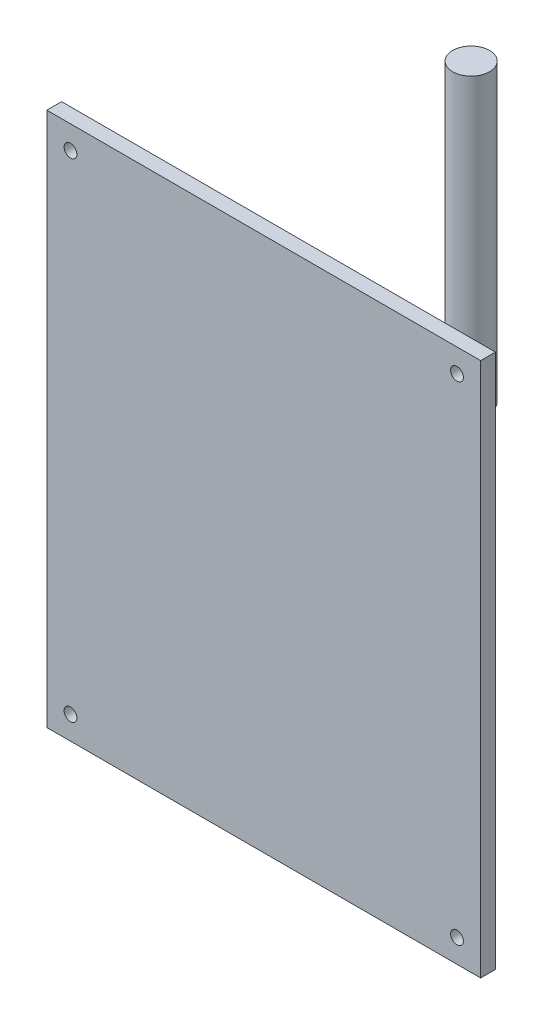
ISO-10303-21;
HEADER;
FILE_DESCRIPTION(('STEP AP214'),'2;1');
FILE_NAME('part.step','',(''),(''),'','','');
FILE_SCHEMA(('AUTOMOTIVE_DESIGN { 1 0 10303 214 1 1 1 1 }'));
ENDSEC;
DATA;
#1=APPLICATION_CONTEXT('core data for automotive mechanical design processes');
#2=APPLICATION_PROTOCOL_DEFINITION('international standard','automotive_design',2000,#1);
#3=PRODUCT_CONTEXT('',#1,'mechanical');
#4=PRODUCT('Part','Part','',(#3));
#5=PRODUCT_RELATED_PRODUCT_CATEGORY('part','',(#4));
#6=PRODUCT_DEFINITION_FORMATION('','',#4);
#7=PRODUCT_DEFINITION_CONTEXT('part definition',#1,'design');
#8=PRODUCT_DEFINITION('design','',#6,#7);
#9=PRODUCT_DEFINITION_SHAPE('','',#8);
#10=(LENGTH_UNIT() NAMED_UNIT(*) SI_UNIT(.MILLI.,.METRE.));
#11=(NAMED_UNIT(*) PLANE_ANGLE_UNIT() SI_UNIT($,.RADIAN.));
#12=(NAMED_UNIT(*) SI_UNIT($,.STERADIAN.) SOLID_ANGLE_UNIT());
#13=UNCERTAINTY_MEASURE_WITH_UNIT(LENGTH_MEASURE(1.E-05),#10,'distance_accuracy_value','');
#14=(GEOMETRIC_REPRESENTATION_CONTEXT(3) GLOBAL_UNCERTAINTY_ASSIGNED_CONTEXT((#13)) GLOBAL_UNIT_ASSIGNED_CONTEXT((#10,
#11,#12)) REPRESENTATION_CONTEXT('',''));
#15=CARTESIAN_POINT('',(0.,0.,0.));
#16=DIRECTION('',(0.,0.,1.));
#17=DIRECTION('',(1.,0.,0.));
#18=AXIS2_PLACEMENT_3D('',#15,#16,#17);
#19=CARTESIAN_POINT('',(29.9639569522915,33.3,-3.175));
#20=DIRECTION('',(0.,1.,0.));
#21=DIRECTION('',(0.,0.,1.));
#22=AXIS2_PLACEMENT_3D('',#19,#20,#21);
#23=CYLINDRICAL_SURFACE('',#22,3.175);
#24=CARTESIAN_POINT('',(29.9639569522915,33.3,-3.175));
#25=DIRECTION('',(0.,1.,0.));
#26=DIRECTION('',(0.,0.,1.));
#27=AXIS2_PLACEMENT_3D('',#24,#25,#26);
#28=CIRCLE('',#27,3.175);
#29=CARTESIAN_POINT('',(29.9639569522915,33.3,0.));
#30=VERTEX_POINT('',#29);
#31=EDGE_CURVE('E11',#30,#30,#28,.T.);
#32=ORIENTED_EDGE('',*,*,#31,.T.);
#33=EDGE_LOOP('',(#32));
#34=FACE_BOUND('',#33,.T.);
#35=CARTESIAN_POINT('',(29.9639569522915,84.1,-3.175));
#36=DIRECTION('',(0.,1.,0.));
#37=DIRECTION('',(0.,0.,1.));
#38=AXIS2_PLACEMENT_3D('',#35,#36,#37);
#39=CIRCLE('',#38,3.175);
#40=CARTESIAN_POINT('',(29.9639569522915,84.1,0.));
#41=VERTEX_POINT('',#40);
#42=EDGE_CURVE('E56',#41,#41,#39,.T.);
#43=ORIENTED_EDGE('',*,*,#42,.F.);
#44=EDGE_LOOP('',(#43));
#45=FACE_BOUND('',#44,.T.);
#46=ADVANCED_FACE('F50',(#34,#45),#23,.T.);
#47=CARTESIAN_POINT('',(29.9639569522915,33.3,-3.175));
#48=DIRECTION('',(0.,1.,0.));
#49=DIRECTION('',(0.,0.,1.));
#50=AXIS2_PLACEMENT_3D('',#47,#48,#49);
#51=PLANE('',#50);
#52=ORIENTED_EDGE('',*,*,#31,.F.);
#53=EDGE_LOOP('',(#52));
#54=FACE_BOUND('',#53,.T.);
#55=ADVANCED_FACE('F65',(#54),#51,.F.);
#56=CARTESIAN_POINT('',(29.9639569522915,84.1,-3.175));
#57=DIRECTION('',(0.,1.,0.));
#58=DIRECTION('',(0.,0.,1.));
#59=AXIS2_PLACEMENT_3D('',#56,#57,#58);
#60=PLANE('',#59);
#61=ORIENTED_EDGE('',*,*,#42,.T.);
#62=EDGE_LOOP('',(#61));
#63=FACE_BOUND('',#62,.T.);
#64=ADVANCED_FACE('F62',(#63),#60,.T.);
#65=CLOSED_SHELL('',(#46,#55,#64));
#66=MANIFOLD_SOLID_BREP('B2',#65);
#67=CARTESIAN_POINT('',(-37.325,-46.,2.54));
#68=DIRECTION('',(-1.,0.,0.));
#69=DIRECTION('',(0.,0.,1.));
#70=AXIS2_PLACEMENT_3D('',#67,#68,#69);
#71=PLANE('',#70);
#72=DIRECTION('',(0.,1.,0.));
#73=VECTOR('',#72,1.);
#74=CARTESIAN_POINT('',(-37.325,-46.,0.));
#75=LINE('',#74,#73);
#76=CARTESIAN_POINT('',(-37.325,-46.,0.));
#77=VERTEX_POINT('',#76);
#78=CARTESIAN_POINT('',(-37.325,46.,0.));
#79=VERTEX_POINT('',#78);
#80=EDGE_CURVE('E168',#77,#79,#75,.T.);
#81=ORIENTED_EDGE('',*,*,#80,.F.);
#82=DIRECTION('',(0.,0.,-1.));
#83=VECTOR('',#82,1.);
#84=CARTESIAN_POINT('',(-37.325,-46.,2.54));
#85=LINE('',#84,#83);
#86=CARTESIAN_POINT('',(-37.325,-46.,2.54));
#87=VERTEX_POINT('',#86);
#88=EDGE_CURVE('E48',#87,#77,#85,.T.);
#89=ORIENTED_EDGE('',*,*,#88,.F.);
#90=DIRECTION('',(0.,1.,0.));
#91=VECTOR('',#90,1.);
#92=CARTESIAN_POINT('',(-37.325,-46.,2.54));
#93=LINE('',#92,#91);
#94=CARTESIAN_POINT('',(-37.325,46.,2.54));
#95=VERTEX_POINT('',#94);
#96=EDGE_CURVE('E160',#87,#95,#93,.T.);
#97=ORIENTED_EDGE('',*,*,#96,.T.);
#98=DIRECTION('',(0.,0.,-1.));
#99=VECTOR('',#98,1.);
#100=CARTESIAN_POINT('',(-37.325,46.,2.54));
#101=LINE('',#100,#99);
#102=EDGE_CURVE('E99',#95,#79,#101,.T.);
#103=ORIENTED_EDGE('',*,*,#102,.T.);
#104=EDGE_LOOP('',(#81,#89,#97,#103));
#105=FACE_BOUND('',#104,.T.);
#106=ADVANCED_FACE('F96',(#105),#71,.T.);
#107=CARTESIAN_POINT('',(-37.325,-46.,2.54));
#108=DIRECTION('',(0.,1.,0.));
#109=DIRECTION('',(0.,0.,1.));
#110=AXIS2_PLACEMENT_3D('',#107,#108,#109);
#111=PLANE('',#110);
#112=DIRECTION('',(1.,0.,0.));
#113=VECTOR('',#112,1.);
#114=CARTESIAN_POINT('',(-37.325,-46.,0.));
#115=LINE('',#114,#113);
#116=CARTESIAN_POINT('',(37.325,-46.,0.));
#117=VERTEX_POINT('',#116);
#118=EDGE_CURVE('E130',#77,#117,#115,.T.);
#119=ORIENTED_EDGE('',*,*,#118,.T.);
#120=DIRECTION('',(0.,0.,-1.));
#121=VECTOR('',#120,1.);
#122=CARTESIAN_POINT('',(37.325,-46.,2.54));
#123=LINE('',#122,#121);
#124=CARTESIAN_POINT('',(37.325,-46.,2.54));
#125=VERTEX_POINT('',#124);
#126=EDGE_CURVE('E106',#125,#117,#123,.T.);
#127=ORIENTED_EDGE('',*,*,#126,.F.);
#128=DIRECTION('',(1.,0.,0.));
#129=VECTOR('',#128,1.);
#130=CARTESIAN_POINT('',(-37.325,-46.,2.54));
#131=LINE('',#130,#129);
#132=EDGE_CURVE('E147',#87,#125,#131,.T.);
#133=ORIENTED_EDGE('',*,*,#132,.F.);
#134=ORIENTED_EDGE('',*,*,#88,.T.);
#135=EDGE_LOOP('',(#119,#127,#133,#134));
#136=FACE_BOUND('',#135,.T.);
#137=ADVANCED_FACE('F185',(#136),#111,.F.);
#138=CARTESIAN_POINT('',(37.325,-46.,2.54));
#139=DIRECTION('',(-1.,0.,0.));
#140=DIRECTION('',(0.,0.,1.));
#141=AXIS2_PLACEMENT_3D('',#138,#139,#140);
#142=PLANE('',#141);
#143=DIRECTION('',(0.,1.,0.));
#144=VECTOR('',#143,1.);
#145=CARTESIAN_POINT('',(37.325,-46.,0.));
#146=LINE('',#145,#144);
#147=CARTESIAN_POINT('',(37.325,46.,0.));
#148=VERTEX_POINT('',#147);
#149=EDGE_CURVE('E156',#117,#148,#146,.T.);
#150=ORIENTED_EDGE('',*,*,#149,.T.);
#151=DIRECTION('',(0.,0.,-1.));
#152=VECTOR('',#151,1.);
#153=CARTESIAN_POINT('',(37.325,46.,2.54));
#154=LINE('',#153,#152);
#155=CARTESIAN_POINT('',(37.325,46.,2.54));
#156=VERTEX_POINT('',#155);
#157=EDGE_CURVE('E153',#156,#148,#154,.T.);
#158=ORIENTED_EDGE('',*,*,#157,.F.);
#159=DIRECTION('',(0.,1.,0.));
#160=VECTOR('',#159,1.);
#161=CARTESIAN_POINT('',(37.325,-46.,2.54));
#162=LINE('',#161,#160);
#163=EDGE_CURVE('E142',#125,#156,#162,.T.);
#164=ORIENTED_EDGE('',*,*,#163,.F.);
#165=ORIENTED_EDGE('',*,*,#126,.T.);
#166=EDGE_LOOP('',(#150,#158,#164,#165));
#167=FACE_BOUND('',#166,.T.);
#168=ADVANCED_FACE('F154',(#167),#142,.F.);
#169=CARTESIAN_POINT('',(-37.325,46.,2.54));
#170=DIRECTION('',(0.,1.,0.));
#171=DIRECTION('',(0.,0.,1.));
#172=AXIS2_PLACEMENT_3D('',#169,#170,#171);
#173=PLANE('',#172);
#174=DIRECTION('',(1.,0.,0.));
#175=VECTOR('',#174,1.);
#176=CARTESIAN_POINT('',(-37.325,46.,0.));
#177=LINE('',#176,#175);
#178=EDGE_CURVE('E172',#79,#148,#177,.T.);
#179=ORIENTED_EDGE('',*,*,#178,.F.);
#180=ORIENTED_EDGE('',*,*,#102,.F.);
#181=DIRECTION('',(1.,0.,0.));
#182=VECTOR('',#181,1.);
#183=CARTESIAN_POINT('',(-37.325,46.,2.54));
#184=LINE('',#183,#182);
#185=EDGE_CURVE('E146',#95,#156,#184,.T.);
#186=ORIENTED_EDGE('',*,*,#185,.T.);
#187=ORIENTED_EDGE('',*,*,#157,.T.);
#188=EDGE_LOOP('',(#179,#180,#186,#187));
#189=FACE_BOUND('',#188,.T.);
#190=ADVANCED_FACE('F158',(#189),#173,.T.);
#191=CARTESIAN_POINT('',(0.,0.,2.54));
#192=DIRECTION('',(0.,0.,-1.));
#193=DIRECTION('',(-1.,0.,0.));
#194=AXIS2_PLACEMENT_3D('',#191,#192,#193);
#195=PLANE('',#194);
#196=CARTESIAN_POINT('',(-33.25,42.,2.54));
#197=DIRECTION('',(0.,0.,1.));
#198=DIRECTION('',(1.,0.,0.));
#199=AXIS2_PLACEMENT_3D('',#196,#197,#198);
#200=CIRCLE('',#199,1.1);
#201=CARTESIAN_POINT('',(-32.15,42.,2.54));
#202=VERTEX_POINT('',#201);
#203=EDGE_CURVE('E228',#202,#202,#200,.T.);
#204=ORIENTED_EDGE('',*,*,#203,.F.);
#205=EDGE_LOOP('',(#204));
#206=FACE_BOUND('',#205,.T.);
#207=CARTESIAN_POINT('',(33.25,42.,2.54));
#208=DIRECTION('',(0.,0.,1.));
#209=DIRECTION('',(1.,0.,0.));
#210=AXIS2_PLACEMENT_3D('',#207,#208,#209);
#211=CIRCLE('',#210,1.1);
#212=CARTESIAN_POINT('',(34.35,42.,2.54));
#213=VERTEX_POINT('',#212);
#214=EDGE_CURVE('E234',#213,#213,#211,.T.);
#215=ORIENTED_EDGE('',*,*,#214,.F.);
#216=EDGE_LOOP('',(#215));
#217=FACE_BOUND('',#216,.T.);
#218=CARTESIAN_POINT('',(33.25,-42.,2.54));
#219=DIRECTION('',(0.,0.,1.));
#220=DIRECTION('',(1.,0.,0.));
#221=AXIS2_PLACEMENT_3D('',#218,#219,#220);
#222=CIRCLE('',#221,1.1);
#223=CARTESIAN_POINT('',(34.35,-42.,2.54));
#224=VERTEX_POINT('',#223);
#225=EDGE_CURVE('E241',#224,#224,#222,.T.);
#226=ORIENTED_EDGE('',*,*,#225,.F.);
#227=EDGE_LOOP('',(#226));
#228=FACE_BOUND('',#227,.T.);
#229=CARTESIAN_POINT('',(-33.25,-42.,2.54));
#230=DIRECTION('',(0.,0.,1.));
#231=DIRECTION('',(1.,0.,0.));
#232=AXIS2_PLACEMENT_3D('',#229,#230,#231);
#233=CIRCLE('',#232,1.1);
#234=CARTESIAN_POINT('',(-32.15,-42.,2.54));
#235=VERTEX_POINT('',#234);
#236=EDGE_CURVE('E249',#235,#235,#233,.T.);
#237=ORIENTED_EDGE('',*,*,#236,.F.);
#238=EDGE_LOOP('',(#237));
#239=FACE_BOUND('',#238,.T.);
#240=ORIENTED_EDGE('',*,*,#96,.F.);
#241=ORIENTED_EDGE('',*,*,#132,.T.);
#242=ORIENTED_EDGE('',*,*,#163,.T.);
#243=ORIENTED_EDGE('',*,*,#185,.F.);
#244=EDGE_LOOP('',(#240,#241,#242,#243));
#245=FACE_BOUND('',#244,.T.);
#246=ADVANCED_FACE('F145',(#206,#217,#228,#239,#245),#195,.F.);
#247=CARTESIAN_POINT('',(0.,0.,0.));
#248=DIRECTION('',(0.,0.,-1.));
#249=DIRECTION('',(-1.,0.,0.));
#250=AXIS2_PLACEMENT_3D('',#247,#248,#249);
#251=PLANE('',#250);
#252=CARTESIAN_POINT('',(-33.25,42.,0.));
#253=DIRECTION('',(0.,0.,-1.));
#254=DIRECTION('',(-1.,0.,0.));
#255=AXIS2_PLACEMENT_3D('',#252,#253,#254);
#256=CIRCLE('',#255,1.1);
#257=CARTESIAN_POINT('',(-34.35,42.,0.));
#258=VERTEX_POINT('',#257);
#259=EDGE_CURVE('E173',#258,#258,#256,.F.);
#260=ORIENTED_EDGE('',*,*,#259,.T.);
#261=EDGE_LOOP('',(#260));
#262=FACE_BOUND('',#261,.T.);
#263=CARTESIAN_POINT('',(33.25,42.,0.));
#264=DIRECTION('',(0.,0.,-1.));
#265=DIRECTION('',(-1.,0.,0.));
#266=AXIS2_PLACEMENT_3D('',#263,#264,#265);
#267=CIRCLE('',#266,1.1);
#268=CARTESIAN_POINT('',(32.15,42.,0.));
#269=VERTEX_POINT('',#268);
#270=EDGE_CURVE('E237',#269,#269,#267,.F.);
#271=ORIENTED_EDGE('',*,*,#270,.T.);
#272=EDGE_LOOP('',(#271));
#273=FACE_BOUND('',#272,.T.);
#274=CARTESIAN_POINT('',(33.25,-42.,0.));
#275=DIRECTION('',(0.,0.,-1.));
#276=DIRECTION('',(-1.,0.,0.));
#277=AXIS2_PLACEMENT_3D('',#274,#275,#276);
#278=CIRCLE('',#277,1.1);
#279=CARTESIAN_POINT('',(32.15,-42.,0.));
#280=VERTEX_POINT('',#279);
#281=EDGE_CURVE('E245',#280,#280,#278,.F.);
#282=ORIENTED_EDGE('',*,*,#281,.T.);
#283=EDGE_LOOP('',(#282));
#284=FACE_BOUND('',#283,.T.);
#285=CARTESIAN_POINT('',(-33.25,-42.,0.));
#286=DIRECTION('',(0.,0.,-1.));
#287=DIRECTION('',(-1.,0.,0.));
#288=AXIS2_PLACEMENT_3D('',#285,#286,#287);
#289=CIRCLE('',#288,1.1);
#290=CARTESIAN_POINT('',(-34.35,-42.,0.));
#291=VERTEX_POINT('',#290);
#292=EDGE_CURVE('E253',#291,#291,#289,.F.);
#293=ORIENTED_EDGE('',*,*,#292,.T.);
#294=EDGE_LOOP('',(#293));
#295=FACE_BOUND('',#294,.T.);
#296=ORIENTED_EDGE('',*,*,#178,.T.);
#297=ORIENTED_EDGE('',*,*,#149,.F.);
#298=ORIENTED_EDGE('',*,*,#118,.F.);
#299=ORIENTED_EDGE('',*,*,#80,.T.);
#300=EDGE_LOOP('',(#296,#297,#298,#299));
#301=FACE_BOUND('',#300,.T.);
#302=ADVANCED_FACE('F182',(#262,#273,#284,#295,#301),#251,.T.);
#303=CARTESIAN_POINT('',(-33.25,-42.,-3.1112698372208));
#304=DIRECTION('',(0.,0.,1.));
#305=DIRECTION('',(1.,0.,0.));
#306=AXIS2_PLACEMENT_3D('',#303,#304,#305);
#307=CYLINDRICAL_SURFACE('',#306,1.1);
#308=ORIENTED_EDGE('',*,*,#236,.T.);
#309=EDGE_LOOP('',(#308));
#310=FACE_BOUND('',#309,.T.);
#311=ORIENTED_EDGE('',*,*,#292,.F.);
#312=EDGE_LOOP('',(#311));
#313=FACE_BOUND('',#312,.T.);
#314=ADVANCED_FACE('F205',(#310,#313),#307,.F.);
#315=CARTESIAN_POINT('',(33.25,-42.,-3.1112698372208));
#316=DIRECTION('',(0.,0.,1.));
#317=DIRECTION('',(1.,0.,0.));
#318=AXIS2_PLACEMENT_3D('',#315,#316,#317);
#319=CYLINDRICAL_SURFACE('',#318,1.1);
#320=ORIENTED_EDGE('',*,*,#225,.T.);
#321=EDGE_LOOP('',(#320));
#322=FACE_BOUND('',#321,.T.);
#323=ORIENTED_EDGE('',*,*,#281,.F.);
#324=EDGE_LOOP('',(#323));
#325=FACE_BOUND('',#324,.T.);
#326=ADVANCED_FACE('F212',(#322,#325),#319,.F.);
#327=CARTESIAN_POINT('',(33.25,42.,-3.1112698372208));
#328=DIRECTION('',(0.,0.,1.));
#329=DIRECTION('',(1.,0.,0.));
#330=AXIS2_PLACEMENT_3D('',#327,#328,#329);
#331=CYLINDRICAL_SURFACE('',#330,1.1);
#332=ORIENTED_EDGE('',*,*,#214,.T.);
#333=EDGE_LOOP('',(#332));
#334=FACE_BOUND('',#333,.T.);
#335=ORIENTED_EDGE('',*,*,#270,.F.);
#336=EDGE_LOOP('',(#335));
#337=FACE_BOUND('',#336,.T.);
#338=ADVANCED_FACE('F216',(#334,#337),#331,.F.);
#339=CARTESIAN_POINT('',(-33.25,42.,-3.1112698372208));
#340=DIRECTION('',(0.,0.,1.));
#341=DIRECTION('',(1.,0.,0.));
#342=AXIS2_PLACEMENT_3D('',#339,#340,#341);
#343=CYLINDRICAL_SURFACE('',#342,1.1);
#344=ORIENTED_EDGE('',*,*,#203,.T.);
#345=EDGE_LOOP('',(#344));
#346=FACE_BOUND('',#345,.T.);
#347=ORIENTED_EDGE('',*,*,#259,.F.);
#348=EDGE_LOOP('',(#347));
#349=FACE_BOUND('',#348,.T.);
#350=ADVANCED_FACE('F220',(#346,#349),#343,.F.);
#351=CLOSED_SHELL('',(#106,#137,#168,#190,#246,#302,#314,#326,#338,#350));
#352=MANIFOLD_SOLID_BREP('B6',#351);
#353=ADVANCED_BREP_SHAPE_REPRESENTATION('',(#18,#66,#352),#14);
#354=SHAPE_DEFINITION_REPRESENTATION(#9,#353);
ENDSEC;
END-ISO-10303-21;
